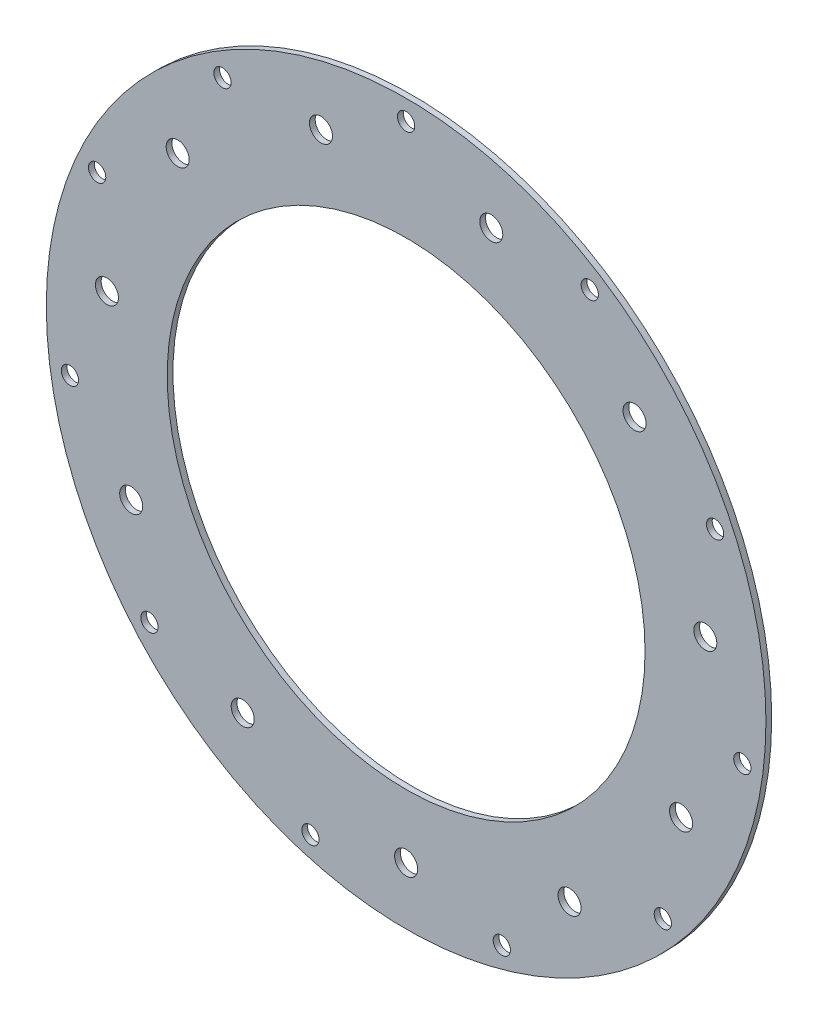
ISO-10303-21;
HEADER;
FILE_DESCRIPTION(('STEP AP214'),'2;1');
FILE_NAME('part.step','',(''),(''),'','','');
FILE_SCHEMA(('AUTOMOTIVE_DESIGN { 1 0 10303 214 1 1 1 1 }'));
ENDSEC;
DATA;
#1=APPLICATION_CONTEXT('core data for automotive mechanical design processes');
#2=APPLICATION_PROTOCOL_DEFINITION('international standard','automotive_design',2000,#1);
#3=PRODUCT_CONTEXT('',#1,'mechanical');
#4=PRODUCT('Part','Part','',(#3));
#5=PRODUCT_RELATED_PRODUCT_CATEGORY('part','',(#4));
#6=PRODUCT_DEFINITION_FORMATION('','',#4);
#7=PRODUCT_DEFINITION_CONTEXT('part definition',#1,'design');
#8=PRODUCT_DEFINITION('design','',#6,#7);
#9=PRODUCT_DEFINITION_SHAPE('','',#8);
#10=(LENGTH_UNIT() NAMED_UNIT(*) SI_UNIT(.MILLI.,.METRE.));
#11=(NAMED_UNIT(*) PLANE_ANGLE_UNIT() SI_UNIT($,.RADIAN.));
#12=(NAMED_UNIT(*) SI_UNIT($,.STERADIAN.) SOLID_ANGLE_UNIT());
#13=UNCERTAINTY_MEASURE_WITH_UNIT(LENGTH_MEASURE(1.E-05),#10,'distance_accuracy_value','');
#14=(GEOMETRIC_REPRESENTATION_CONTEXT(3) GLOBAL_UNCERTAINTY_ASSIGNED_CONTEXT((#13)) GLOBAL_UNIT_ASSIGNED_CONTEXT((#10,
#11,#12)) REPRESENTATION_CONTEXT('',''));
#15=CARTESIAN_POINT('',(0.,0.,0.));
#16=DIRECTION('',(0.,0.,1.));
#17=DIRECTION('',(1.,0.,0.));
#18=AXIS2_PLACEMENT_3D('',#15,#16,#17);
#19=CARTESIAN_POINT('',(0.,0.,1.));
#20=DIRECTION('',(0.,0.,1.));
#21=DIRECTION('',(1.,0.,0.));
#22=AXIS2_PLACEMENT_3D('',#19,#20,#21);
#23=PLANE('',#22);
#24=CARTESIAN_POINT('',(47.755679756112,-21.8092881825996,1.));
#25=DIRECTION('',(0.,0.,1.));
#26=DIRECTION('',(1.,0.,0.));
#27=AXIS2_PLACEMENT_3D('',#24,#25,#26);
#28=CIRCLE('',#27,2.);
#29=CARTESIAN_POINT('',(49.755679756112,-21.8092881825996,1.));
#30=VERTEX_POINT('',#29);
#31=EDGE_CURVE('E170',#30,#30,#28,.T.);
#32=ORIENTED_EDGE('',*,*,#31,.F.);
#33=EDGE_LOOP('',(#32));
#34=FACE_BOUND('',#33,.T.);
#35=CARTESIAN_POINT('',(39.6768526535989,34.3801885321271,1.));
#36=DIRECTION('',(0.,0.,1.));
#37=DIRECTION('',(1.,0.,0.));
#38=AXIS2_PLACEMENT_3D('',#35,#36,#37);
#39=CIRCLE('',#38,2.);
#40=CARTESIAN_POINT('',(41.6768526535989,34.3801885321271,1.));
#41=VERTEX_POINT('',#40);
#42=EDGE_CURVE('E158',#41,#41,#39,.T.);
#43=ORIENTED_EDGE('',*,*,#42,.F.);
#44=EDGE_LOOP('',(#43));
#45=FACE_BOUND('',#44,.T.);
#46=CARTESIAN_POINT('',(-14.7909592341747,50.3733811147612,1.));
#47=DIRECTION('',(0.,0.,1.));
#48=DIRECTION('',(1.,0.,0.));
#49=AXIS2_PLACEMENT_3D('',#46,#47,#48);
#50=CIRCLE('',#49,2.);
#51=CARTESIAN_POINT('',(-12.7909592341747,50.3733811147612,1.));
#52=VERTEX_POINT('',#51);
#53=EDGE_CURVE('E146',#52,#52,#50,.T.);
#54=ORIENTED_EDGE('',*,*,#53,.F.);
#55=EDGE_LOOP('',(#54));
#56=FACE_BOUND('',#55,.T.);
#57=CARTESIAN_POINT('',(-51.9656256987489,7.47152900934767,1.));
#58=DIRECTION('',(0.,0.,1.));
#59=DIRECTION('',(1.,0.,0.));
#60=AXIS2_PLACEMENT_3D('',#57,#58,#59);
#61=CIRCLE('',#60,2.);
#62=CARTESIAN_POINT('',(-49.9656256987489,7.47152900934767,1.));
#63=VERTEX_POINT('',#62);
#64=EDGE_CURVE('E134',#63,#63,#61,.T.);
#65=ORIENTED_EDGE('',*,*,#64,.F.);
#66=EDGE_LOOP('',(#65));
#67=FACE_BOUND('',#66,.T.);
#68=CARTESIAN_POINT('',(-28.3836429164189,-44.165810473637,1.));
#69=DIRECTION('',(0.,0.,1.));
#70=DIRECTION('',(1.,0.,0.));
#71=AXIS2_PLACEMENT_3D('',#68,#69,#70);
#72=CIRCLE('',#71,2.);
#73=CARTESIAN_POINT('',(-26.3836429164189,-44.165810473637,1.));
#74=VERTEX_POINT('',#73);
#75=EDGE_CURVE('E122',#74,#74,#72,.T.);
#76=ORIENTED_EDGE('',*,*,#75,.F.);
#77=EDGE_LOOP('',(#76));
#78=FACE_BOUND('',#77,.T.);
#79=CARTESIAN_POINT('',(44.5892248869008,-38.6367833027724,1.));
#80=DIRECTION('',(0.,0.,1.));
#81=DIRECTION('',(1.,0.,0.));
#82=AXIS2_PLACEMENT_3D('',#79,#80,#81);
#83=CIRCLE('',#82,1.5);
#84=CARTESIAN_POINT('',(46.0892248869008,-38.6367833027724,1.));
#85=VERTEX_POINT('',#84);
#86=EDGE_CURVE('E110',#85,#85,#83,.T.);
#87=ORIENTED_EDGE('',*,*,#86,.F.);
#88=EDGE_LOOP('',(#87));
#89=FACE_BOUND('',#88,.T.);
#90=CARTESIAN_POINT('',(53.6682877259168,24.5094857671108,1.));
#91=DIRECTION('',(0.,0.,1.));
#92=DIRECTION('',(1.,0.,0.));
#93=AXIS2_PLACEMENT_3D('',#90,#91,#92);
#94=CIRCLE('',#93,1.5);
#95=CARTESIAN_POINT('',(55.1682877259168,24.5094857671108,1.));
#96=VERTEX_POINT('',#95);
#97=EDGE_CURVE('E98',#96,#96,#94,.T.);
#98=ORIENTED_EDGE('',*,*,#97,.F.);
#99=EDGE_LOOP('',(#98));
#100=FACE_BOUND('',#99,.T.);
#101=CARTESIAN_POINT('',(4.30211422042248E-13,59.,1.));
#102=DIRECTION('',(0.,0.,1.));
#103=DIRECTION('',(1.,0.,0.));
#104=AXIS2_PLACEMENT_3D('',#101,#102,#103);
#105=CIRCLE('',#104,1.5);
#106=CARTESIAN_POINT('',(1.50000000000043,59.,1.));
#107=VERTEX_POINT('',#106);
#108=EDGE_CURVE('E86',#107,#107,#105,.T.);
#109=ORIENTED_EDGE('',*,*,#108,.F.);
#110=EDGE_LOOP('',(#109));
#111=FACE_BOUND('',#110,.T.);
#112=CARTESIAN_POINT('',(-53.6682877259165,24.5094857671115,1.));
#113=DIRECTION('',(0.,0.,1.));
#114=DIRECTION('',(1.,0.,0.));
#115=AXIS2_PLACEMENT_3D('',#112,#113,#114);
#116=CIRCLE('',#115,1.5);
#117=CARTESIAN_POINT('',(-52.1682877259165,24.5094857671115,1.));
#118=VERTEX_POINT('',#117);
#119=EDGE_CURVE('E74',#118,#118,#116,.T.);
#120=ORIENTED_EDGE('',*,*,#119,.F.);
#121=EDGE_LOOP('',(#120));
#122=FACE_BOUND('',#121,.T.);
#123=CARTESIAN_POINT('',(-44.5892248869013,-38.6367833027717,1.));
#124=DIRECTION('',(0.,0.,1.));
#125=DIRECTION('',(1.,0.,0.));
#126=AXIS2_PLACEMENT_3D('',#123,#124,#125);
#127=CIRCLE('',#126,1.5);
#128=CARTESIAN_POINT('',(-43.0892248869013,-38.6367833027717,1.));
#129=VERTEX_POINT('',#128);
#130=EDGE_CURVE('E62',#129,#129,#127,.T.);
#131=ORIENTED_EDGE('',*,*,#130,.F.);
#132=EDGE_LOOP('',(#131));
#133=FACE_BOUND('',#132,.T.);
#134=CARTESIAN_POINT('',(-16.6222208536444,-56.6100854432553,1.));
#135=DIRECTION('',(0.,0.,1.));
#136=DIRECTION('',(1.,0.,0.));
#137=AXIS2_PLACEMENT_3D('',#134,#135,#136);
#138=CIRCLE('',#137,1.5);
#139=CARTESIAN_POINT('',(-15.1222208536444,-56.6100854432553,1.));
#140=VERTEX_POINT('',#139);
#141=EDGE_CURVE('E50',#140,#140,#138,.T.);
#142=ORIENTED_EDGE('',*,*,#141,.F.);
#143=EDGE_LOOP('',(#142));
#144=FACE_BOUND('',#143,.T.);
#145=CARTESIAN_POINT('',(0.,0.,1.));
#146=DIRECTION('',(0.,0.,1.));
#147=DIRECTION('',(1.,0.,0.));
#148=AXIS2_PLACEMENT_3D('',#145,#146,#147);
#149=CIRCLE('',#148,62.5);
#150=CARTESIAN_POINT('',(62.5,0.,1.));
#151=VERTEX_POINT('',#150);
#152=EDGE_CURVE('E10',#151,#151,#149,.T.);
#153=ORIENTED_EDGE('',*,*,#152,.T.);
#154=EDGE_LOOP('',(#153));
#155=FACE_BOUND('',#154,.T.);
#156=CARTESIAN_POINT('',(0.,0.,1.));
#157=DIRECTION('',(0.,0.,1.));
#158=DIRECTION('',(1.,0.,0.));
#159=AXIS2_PLACEMENT_3D('',#156,#157,#158);
#160=CIRCLE('',#159,41.5);
#161=CARTESIAN_POINT('',(41.5,0.,1.));
#162=VERTEX_POINT('',#161);
#163=EDGE_CURVE('E45',#162,#162,#160,.T.);
#164=ORIENTED_EDGE('',*,*,#163,.F.);
#165=EDGE_LOOP('',(#164));
#166=FACE_BOUND('',#165,.T.);
#167=CARTESIAN_POINT('',(0.,-52.5,1.));
#168=DIRECTION('',(0.,0.,1.));
#169=DIRECTION('',(1.,0.,0.));
#170=AXIS2_PLACEMENT_3D('',#167,#168,#169);
#171=CIRCLE('',#170,2.);
#172=CARTESIAN_POINT('',(2.,-52.5,1.));
#173=VERTEX_POINT('',#172);
#174=EDGE_CURVE('E56',#173,#173,#171,.T.);
#175=ORIENTED_EDGE('',*,*,#174,.F.);
#176=EDGE_LOOP('',(#175));
#177=FACE_BOUND('',#176,.T.);
#178=CARTESIAN_POINT('',(-58.3994650709751,-8.39657545812364,1.));
#179=DIRECTION('',(0.,0.,1.));
#180=DIRECTION('',(1.,0.,0.));
#181=AXIS2_PLACEMENT_3D('',#178,#179,#180);
#182=CIRCLE('',#181,1.50000000000001);
#183=CARTESIAN_POINT('',(-56.8994650709751,-8.39657545812364,1.));
#184=VERTEX_POINT('',#183);
#185=EDGE_CURVE('E68',#184,#184,#182,.T.);
#186=ORIENTED_EDGE('',*,*,#185,.F.);
#187=EDGE_LOOP('',(#186));
#188=FACE_BOUND('',#187,.T.);
#189=CARTESIAN_POINT('',(-31.89780822988,49.6339584370399,1.));
#190=DIRECTION('',(0.,0.,1.));
#191=DIRECTION('',(1.,0.,0.));
#192=AXIS2_PLACEMENT_3D('',#189,#190,#191);
#193=CIRCLE('',#192,1.5);
#194=CARTESIAN_POINT('',(-30.3978082298799,49.6339584370399,1.));
#195=VERTEX_POINT('',#194);
#196=EDGE_CURVE('E80',#195,#195,#193,.T.);
#197=ORIENTED_EDGE('',*,*,#196,.F.);
#198=EDGE_LOOP('',(#197));
#199=FACE_BOUND('',#198,.T.);
#200=CARTESIAN_POINT('',(31.8978082298807,49.6339584370394,1.));
#201=DIRECTION('',(0.,0.,1.));
#202=DIRECTION('',(1.,0.,0.));
#203=AXIS2_PLACEMENT_3D('',#200,#201,#202);
#204=CIRCLE('',#203,1.5);
#205=CARTESIAN_POINT('',(33.3978082298807,49.6339584370394,1.));
#206=VERTEX_POINT('',#205);
#207=EDGE_CURVE('E92',#206,#206,#204,.T.);
#208=ORIENTED_EDGE('',*,*,#207,.F.);
#209=EDGE_LOOP('',(#208));
#210=FACE_BOUND('',#209,.T.);
#211=CARTESIAN_POINT('',(58.3994650709749,-8.39657545812446,1.));
#212=DIRECTION('',(0.,0.,1.));
#213=DIRECTION('',(1.,0.,0.));
#214=AXIS2_PLACEMENT_3D('',#211,#212,#213);
#215=CIRCLE('',#214,1.5);
#216=CARTESIAN_POINT('',(59.8994650709749,-8.39657545812446,1.));
#217=VERTEX_POINT('',#216);
#218=EDGE_CURVE('E104',#217,#217,#215,.T.);
#219=ORIENTED_EDGE('',*,*,#218,.F.);
#220=EDGE_LOOP('',(#219));
#221=FACE_BOUND('',#220,.T.);
#222=CARTESIAN_POINT('',(16.6222208536436,-56.6100854432556,1.));
#223=DIRECTION('',(0.,0.,1.));
#224=DIRECTION('',(1.,0.,0.));
#225=AXIS2_PLACEMENT_3D('',#222,#223,#224);
#226=CIRCLE('',#225,1.50000000000001);
#227=CARTESIAN_POINT('',(18.1222208536436,-56.6100854432556,1.));
#228=VERTEX_POINT('',#227);
#229=EDGE_CURVE('E116',#228,#228,#226,.T.);
#230=ORIENTED_EDGE('',*,*,#229,.F.);
#231=EDGE_LOOP('',(#230));
#232=FACE_BOUND('',#231,.T.);
#233=CARTESIAN_POINT('',(-47.7556797561123,-21.8092881825989,1.));
#234=DIRECTION('',(0.,0.,1.));
#235=DIRECTION('',(1.,0.,0.));
#236=AXIS2_PLACEMENT_3D('',#233,#234,#235);
#237=CIRCLE('',#236,2.);
#238=CARTESIAN_POINT('',(-45.7556797561123,-21.8092881825989,1.));
#239=VERTEX_POINT('',#238);
#240=EDGE_CURVE('E128',#239,#239,#237,.T.);
#241=ORIENTED_EDGE('',*,*,#240,.F.);
#242=EDGE_LOOP('',(#241));
#243=FACE_BOUND('',#242,.T.);
#244=CARTESIAN_POINT('',(-39.6768526535984,34.3801885321277,1.));
#245=DIRECTION('',(0.,0.,1.));
#246=DIRECTION('',(1.,0.,0.));
#247=AXIS2_PLACEMENT_3D('',#244,#245,#246);
#248=CIRCLE('',#247,2.);
#249=CARTESIAN_POINT('',(-37.6768526535984,34.3801885321277,1.));
#250=VERTEX_POINT('',#249);
#251=EDGE_CURVE('E140',#250,#250,#248,.T.);
#252=ORIENTED_EDGE('',*,*,#251,.F.);
#253=EDGE_LOOP('',(#252));
#254=FACE_BOUND('',#253,.T.);
#255=CARTESIAN_POINT('',(14.7909592341754,50.373381114761,1.));
#256=DIRECTION('',(0.,0.,1.));
#257=DIRECTION('',(1.,0.,0.));
#258=AXIS2_PLACEMENT_3D('',#255,#256,#257);
#259=CIRCLE('',#258,2.);
#260=CARTESIAN_POINT('',(16.7909592341754,50.373381114761,1.));
#261=VERTEX_POINT('',#260);
#262=EDGE_CURVE('E152',#261,#261,#259,.T.);
#263=ORIENTED_EDGE('',*,*,#262,.F.);
#264=EDGE_LOOP('',(#263));
#265=FACE_BOUND('',#264,.T.);
#266=CARTESIAN_POINT('',(51.965625698749,7.47152900934692,1.));
#267=DIRECTION('',(0.,0.,1.));
#268=DIRECTION('',(1.,0.,0.));
#269=AXIS2_PLACEMENT_3D('',#266,#267,#268);
#270=CIRCLE('',#269,2.);
#271=CARTESIAN_POINT('',(53.965625698749,7.47152900934692,1.));
#272=VERTEX_POINT('',#271);
#273=EDGE_CURVE('E164',#272,#272,#270,.T.);
#274=ORIENTED_EDGE('',*,*,#273,.F.);
#275=EDGE_LOOP('',(#274));
#276=FACE_BOUND('',#275,.T.);
#277=CARTESIAN_POINT('',(28.3836429164183,-44.1658104736374,1.));
#278=DIRECTION('',(0.,0.,1.));
#279=DIRECTION('',(1.,0.,0.));
#280=AXIS2_PLACEMENT_3D('',#277,#278,#279);
#281=CIRCLE('',#280,1.99999999999999);
#282=CARTESIAN_POINT('',(30.3836429164183,-44.1658104736374,1.));
#283=VERTEX_POINT('',#282);
#284=EDGE_CURVE('E176',#283,#283,#281,.T.);
#285=ORIENTED_EDGE('',*,*,#284,.F.);
#286=EDGE_LOOP('',(#285));
#287=FACE_BOUND('',#286,.T.);
#288=ADVANCED_FACE('F34',(#34,#45,#56,#67,#78,#89,#100,#111,#122,#133,#144,#155,#166,#177,#188,
#199,#210,#221,#232,#243,#254,#265,#276,#287),#23,.T.);
#289=CARTESIAN_POINT('',(0.,0.,0.));
#290=DIRECTION('',(0.,0.,1.));
#291=DIRECTION('',(1.,0.,0.));
#292=AXIS2_PLACEMENT_3D('',#289,#290,#291);
#293=PLANE('',#292);
#294=CARTESIAN_POINT('',(0.,0.,0.));
#295=DIRECTION('',(0.,0.,1.));
#296=DIRECTION('',(1.,0.,0.));
#297=AXIS2_PLACEMENT_3D('',#294,#295,#296);
#298=CIRCLE('',#297,62.5);
#299=CARTESIAN_POINT('',(62.5,0.,0.));
#300=VERTEX_POINT('',#299);
#301=EDGE_CURVE('E38',#300,#300,#298,.T.);
#302=ORIENTED_EDGE('',*,*,#301,.F.);
#303=EDGE_LOOP('',(#302));
#304=FACE_BOUND('',#303,.T.);
#305=CARTESIAN_POINT('',(0.,0.,0.));
#306=DIRECTION('',(0.,0.,1.));
#307=DIRECTION('',(1.,0.,0.));
#308=AXIS2_PLACEMENT_3D('',#305,#306,#307);
#309=CIRCLE('',#308,41.5);
#310=CARTESIAN_POINT('',(41.5,0.,0.));
#311=VERTEX_POINT('',#310);
#312=EDGE_CURVE('E47',#311,#311,#309,.T.);
#313=ORIENTED_EDGE('',*,*,#312,.T.);
#314=EDGE_LOOP('',(#313));
#315=FACE_BOUND('',#314,.T.);
#316=CARTESIAN_POINT('',(-16.6222208536444,-56.6100854432553,0.));
#317=DIRECTION('',(0.,0.,1.));
#318=DIRECTION('',(1.,0.,0.));
#319=AXIS2_PLACEMENT_3D('',#316,#317,#318);
#320=CIRCLE('',#319,1.5);
#321=CARTESIAN_POINT('',(-15.1222208536444,-56.6100854432553,0.));
#322=VERTEX_POINT('',#321);
#323=EDGE_CURVE('E53',#322,#322,#320,.T.);
#324=ORIENTED_EDGE('',*,*,#323,.T.);
#325=EDGE_LOOP('',(#324));
#326=FACE_BOUND('',#325,.T.);
#327=CARTESIAN_POINT('',(0.,-52.5,0.));
#328=DIRECTION('',(0.,0.,1.));
#329=DIRECTION('',(1.,0.,0.));
#330=AXIS2_PLACEMENT_3D('',#327,#328,#329);
#331=CIRCLE('',#330,2.);
#332=CARTESIAN_POINT('',(2.,-52.5,0.));
#333=VERTEX_POINT('',#332);
#334=EDGE_CURVE('E59',#333,#333,#331,.T.);
#335=ORIENTED_EDGE('',*,*,#334,.T.);
#336=EDGE_LOOP('',(#335));
#337=FACE_BOUND('',#336,.T.);
#338=CARTESIAN_POINT('',(-44.5892248869013,-38.6367833027717,0.));
#339=DIRECTION('',(0.,0.,1.));
#340=DIRECTION('',(1.,0.,0.));
#341=AXIS2_PLACEMENT_3D('',#338,#339,#340);
#342=CIRCLE('',#341,1.5);
#343=CARTESIAN_POINT('',(-43.0892248869013,-38.6367833027717,0.));
#344=VERTEX_POINT('',#343);
#345=EDGE_CURVE('E65',#344,#344,#342,.T.);
#346=ORIENTED_EDGE('',*,*,#345,.T.);
#347=EDGE_LOOP('',(#346));
#348=FACE_BOUND('',#347,.T.);
#349=CARTESIAN_POINT('',(-58.3994650709751,-8.39657545812364,0.));
#350=DIRECTION('',(0.,0.,1.));
#351=DIRECTION('',(1.,0.,0.));
#352=AXIS2_PLACEMENT_3D('',#349,#350,#351);
#353=CIRCLE('',#352,1.50000000000001);
#354=CARTESIAN_POINT('',(-56.8994650709751,-8.39657545812364,0.));
#355=VERTEX_POINT('',#354);
#356=EDGE_CURVE('E71',#355,#355,#353,.T.);
#357=ORIENTED_EDGE('',*,*,#356,.T.);
#358=EDGE_LOOP('',(#357));
#359=FACE_BOUND('',#358,.T.);
#360=CARTESIAN_POINT('',(-53.6682877259165,24.5094857671115,0.));
#361=DIRECTION('',(0.,0.,1.));
#362=DIRECTION('',(1.,0.,0.));
#363=AXIS2_PLACEMENT_3D('',#360,#361,#362);
#364=CIRCLE('',#363,1.5);
#365=CARTESIAN_POINT('',(-52.1682877259165,24.5094857671115,0.));
#366=VERTEX_POINT('',#365);
#367=EDGE_CURVE('E77',#366,#366,#364,.T.);
#368=ORIENTED_EDGE('',*,*,#367,.T.);
#369=EDGE_LOOP('',(#368));
#370=FACE_BOUND('',#369,.T.);
#371=CARTESIAN_POINT('',(-31.89780822988,49.6339584370399,0.));
#372=DIRECTION('',(0.,0.,1.));
#373=DIRECTION('',(1.,0.,0.));
#374=AXIS2_PLACEMENT_3D('',#371,#372,#373);
#375=CIRCLE('',#374,1.5);
#376=CARTESIAN_POINT('',(-30.3978082298799,49.6339584370399,0.));
#377=VERTEX_POINT('',#376);
#378=EDGE_CURVE('E83',#377,#377,#375,.T.);
#379=ORIENTED_EDGE('',*,*,#378,.T.);
#380=EDGE_LOOP('',(#379));
#381=FACE_BOUND('',#380,.T.);
#382=CARTESIAN_POINT('',(4.30211422042248E-13,59.,0.));
#383=DIRECTION('',(0.,0.,1.));
#384=DIRECTION('',(1.,0.,0.));
#385=AXIS2_PLACEMENT_3D('',#382,#383,#384);
#386=CIRCLE('',#385,1.5);
#387=CARTESIAN_POINT('',(1.50000000000043,59.,0.));
#388=VERTEX_POINT('',#387);
#389=EDGE_CURVE('E89',#388,#388,#386,.T.);
#390=ORIENTED_EDGE('',*,*,#389,.T.);
#391=EDGE_LOOP('',(#390));
#392=FACE_BOUND('',#391,.T.);
#393=CARTESIAN_POINT('',(31.8978082298807,49.6339584370394,0.));
#394=DIRECTION('',(0.,0.,1.));
#395=DIRECTION('',(1.,0.,0.));
#396=AXIS2_PLACEMENT_3D('',#393,#394,#395);
#397=CIRCLE('',#396,1.5);
#398=CARTESIAN_POINT('',(33.3978082298807,49.6339584370394,0.));
#399=VERTEX_POINT('',#398);
#400=EDGE_CURVE('E95',#399,#399,#397,.T.);
#401=ORIENTED_EDGE('',*,*,#400,.T.);
#402=EDGE_LOOP('',(#401));
#403=FACE_BOUND('',#402,.T.);
#404=CARTESIAN_POINT('',(53.6682877259168,24.5094857671108,0.));
#405=DIRECTION('',(0.,0.,1.));
#406=DIRECTION('',(1.,0.,0.));
#407=AXIS2_PLACEMENT_3D('',#404,#405,#406);
#408=CIRCLE('',#407,1.5);
#409=CARTESIAN_POINT('',(55.1682877259168,24.5094857671108,0.));
#410=VERTEX_POINT('',#409);
#411=EDGE_CURVE('E101',#410,#410,#408,.T.);
#412=ORIENTED_EDGE('',*,*,#411,.T.);
#413=EDGE_LOOP('',(#412));
#414=FACE_BOUND('',#413,.T.);
#415=CARTESIAN_POINT('',(58.3994650709749,-8.39657545812446,0.));
#416=DIRECTION('',(0.,0.,1.));
#417=DIRECTION('',(1.,0.,0.));
#418=AXIS2_PLACEMENT_3D('',#415,#416,#417);
#419=CIRCLE('',#418,1.5);
#420=CARTESIAN_POINT('',(59.8994650709749,-8.39657545812446,0.));
#421=VERTEX_POINT('',#420);
#422=EDGE_CURVE('E107',#421,#421,#419,.T.);
#423=ORIENTED_EDGE('',*,*,#422,.T.);
#424=EDGE_LOOP('',(#423));
#425=FACE_BOUND('',#424,.T.);
#426=CARTESIAN_POINT('',(44.5892248869008,-38.6367833027724,0.));
#427=DIRECTION('',(0.,0.,1.));
#428=DIRECTION('',(1.,0.,0.));
#429=AXIS2_PLACEMENT_3D('',#426,#427,#428);
#430=CIRCLE('',#429,1.5);
#431=CARTESIAN_POINT('',(46.0892248869008,-38.6367833027724,0.));
#432=VERTEX_POINT('',#431);
#433=EDGE_CURVE('E113',#432,#432,#430,.T.);
#434=ORIENTED_EDGE('',*,*,#433,.T.);
#435=EDGE_LOOP('',(#434));
#436=FACE_BOUND('',#435,.T.);
#437=CARTESIAN_POINT('',(16.6222208536436,-56.6100854432556,0.));
#438=DIRECTION('',(0.,0.,1.));
#439=DIRECTION('',(1.,0.,0.));
#440=AXIS2_PLACEMENT_3D('',#437,#438,#439);
#441=CIRCLE('',#440,1.50000000000001);
#442=CARTESIAN_POINT('',(18.1222208536436,-56.6100854432556,0.));
#443=VERTEX_POINT('',#442);
#444=EDGE_CURVE('E119',#443,#443,#441,.T.);
#445=ORIENTED_EDGE('',*,*,#444,.T.);
#446=EDGE_LOOP('',(#445));
#447=FACE_BOUND('',#446,.T.);
#448=CARTESIAN_POINT('',(-28.3836429164189,-44.165810473637,0.));
#449=DIRECTION('',(0.,0.,1.));
#450=DIRECTION('',(1.,0.,0.));
#451=AXIS2_PLACEMENT_3D('',#448,#449,#450);
#452=CIRCLE('',#451,2.);
#453=CARTESIAN_POINT('',(-26.3836429164189,-44.165810473637,0.));
#454=VERTEX_POINT('',#453);
#455=EDGE_CURVE('E125',#454,#454,#452,.T.);
#456=ORIENTED_EDGE('',*,*,#455,.T.);
#457=EDGE_LOOP('',(#456));
#458=FACE_BOUND('',#457,.T.);
#459=CARTESIAN_POINT('',(-47.7556797561123,-21.8092881825989,0.));
#460=DIRECTION('',(0.,0.,1.));
#461=DIRECTION('',(1.,0.,0.));
#462=AXIS2_PLACEMENT_3D('',#459,#460,#461);
#463=CIRCLE('',#462,2.);
#464=CARTESIAN_POINT('',(-45.7556797561123,-21.8092881825989,0.));
#465=VERTEX_POINT('',#464);
#466=EDGE_CURVE('E131',#465,#465,#463,.T.);
#467=ORIENTED_EDGE('',*,*,#466,.T.);
#468=EDGE_LOOP('',(#467));
#469=FACE_BOUND('',#468,.T.);
#470=CARTESIAN_POINT('',(-51.9656256987489,7.47152900934767,0.));
#471=DIRECTION('',(0.,0.,1.));
#472=DIRECTION('',(1.,0.,0.));
#473=AXIS2_PLACEMENT_3D('',#470,#471,#472);
#474=CIRCLE('',#473,2.);
#475=CARTESIAN_POINT('',(-49.9656256987489,7.47152900934767,0.));
#476=VERTEX_POINT('',#475);
#477=EDGE_CURVE('E137',#476,#476,#474,.T.);
#478=ORIENTED_EDGE('',*,*,#477,.T.);
#479=EDGE_LOOP('',(#478));
#480=FACE_BOUND('',#479,.T.);
#481=CARTESIAN_POINT('',(-39.6768526535984,34.3801885321277,0.));
#482=DIRECTION('',(0.,0.,1.));
#483=DIRECTION('',(1.,0.,0.));
#484=AXIS2_PLACEMENT_3D('',#481,#482,#483);
#485=CIRCLE('',#484,2.);
#486=CARTESIAN_POINT('',(-37.6768526535984,34.3801885321277,0.));
#487=VERTEX_POINT('',#486);
#488=EDGE_CURVE('E143',#487,#487,#485,.T.);
#489=ORIENTED_EDGE('',*,*,#488,.T.);
#490=EDGE_LOOP('',(#489));
#491=FACE_BOUND('',#490,.T.);
#492=CARTESIAN_POINT('',(-14.7909592341747,50.3733811147612,0.));
#493=DIRECTION('',(0.,0.,1.));
#494=DIRECTION('',(1.,0.,0.));
#495=AXIS2_PLACEMENT_3D('',#492,#493,#494);
#496=CIRCLE('',#495,2.);
#497=CARTESIAN_POINT('',(-12.7909592341747,50.3733811147612,0.));
#498=VERTEX_POINT('',#497);
#499=EDGE_CURVE('E149',#498,#498,#496,.T.);
#500=ORIENTED_EDGE('',*,*,#499,.T.);
#501=EDGE_LOOP('',(#500));
#502=FACE_BOUND('',#501,.T.);
#503=CARTESIAN_POINT('',(14.7909592341754,50.373381114761,0.));
#504=DIRECTION('',(0.,0.,1.));
#505=DIRECTION('',(1.,0.,0.));
#506=AXIS2_PLACEMENT_3D('',#503,#504,#505);
#507=CIRCLE('',#506,2.);
#508=CARTESIAN_POINT('',(16.7909592341754,50.373381114761,0.));
#509=VERTEX_POINT('',#508);
#510=EDGE_CURVE('E155',#509,#509,#507,.T.);
#511=ORIENTED_EDGE('',*,*,#510,.T.);
#512=EDGE_LOOP('',(#511));
#513=FACE_BOUND('',#512,.T.);
#514=CARTESIAN_POINT('',(39.6768526535989,34.3801885321271,0.));
#515=DIRECTION('',(0.,0.,1.));
#516=DIRECTION('',(1.,0.,0.));
#517=AXIS2_PLACEMENT_3D('',#514,#515,#516);
#518=CIRCLE('',#517,2.);
#519=CARTESIAN_POINT('',(41.6768526535989,34.3801885321271,0.));
#520=VERTEX_POINT('',#519);
#521=EDGE_CURVE('E161',#520,#520,#518,.T.);
#522=ORIENTED_EDGE('',*,*,#521,.T.);
#523=EDGE_LOOP('',(#522));
#524=FACE_BOUND('',#523,.T.);
#525=CARTESIAN_POINT('',(51.965625698749,7.47152900934692,0.));
#526=DIRECTION('',(0.,0.,1.));
#527=DIRECTION('',(1.,0.,0.));
#528=AXIS2_PLACEMENT_3D('',#525,#526,#527);
#529=CIRCLE('',#528,2.);
#530=CARTESIAN_POINT('',(53.965625698749,7.47152900934692,0.));
#531=VERTEX_POINT('',#530);
#532=EDGE_CURVE('E167',#531,#531,#529,.T.);
#533=ORIENTED_EDGE('',*,*,#532,.T.);
#534=EDGE_LOOP('',(#533));
#535=FACE_BOUND('',#534,.T.);
#536=CARTESIAN_POINT('',(47.755679756112,-21.8092881825996,0.));
#537=DIRECTION('',(0.,0.,1.));
#538=DIRECTION('',(1.,0.,0.));
#539=AXIS2_PLACEMENT_3D('',#536,#537,#538);
#540=CIRCLE('',#539,2.);
#541=CARTESIAN_POINT('',(49.755679756112,-21.8092881825996,0.));
#542=VERTEX_POINT('',#541);
#543=EDGE_CURVE('E173',#542,#542,#540,.T.);
#544=ORIENTED_EDGE('',*,*,#543,.T.);
#545=EDGE_LOOP('',(#544));
#546=FACE_BOUND('',#545,.T.);
#547=CARTESIAN_POINT('',(28.3836429164183,-44.1658104736374,0.));
#548=DIRECTION('',(0.,0.,1.));
#549=DIRECTION('',(1.,0.,0.));
#550=AXIS2_PLACEMENT_3D('',#547,#548,#549);
#551=CIRCLE('',#550,1.99999999999999);
#552=CARTESIAN_POINT('',(30.3836429164183,-44.1658104736374,0.));
#553=VERTEX_POINT('',#552);
#554=EDGE_CURVE('E179',#553,#553,#551,.T.);
#555=ORIENTED_EDGE('',*,*,#554,.T.);
#556=EDGE_LOOP('',(#555));
#557=FACE_BOUND('',#556,.T.);
#558=ADVANCED_FACE('F189',(#304,#315,#326,#337,#348,#359,#370,#381,#392,#403,#414,#425,#436,
#447,#458,#469,#480,#491,#502,#513,#524,#535,#546,#557),#293,.F.);
#559=CARTESIAN_POINT('',(0.,0.,1.));
#560=DIRECTION('',(0.,0.,-1.));
#561=DIRECTION('',(-1.,0.,0.));
#562=AXIS2_PLACEMENT_3D('',#559,#560,#561);
#563=CYLINDRICAL_SURFACE('',#562,62.5);
#564=ORIENTED_EDGE('',*,*,#152,.F.);
#565=EDGE_LOOP('',(#564));
#566=FACE_BOUND('',#565,.T.);
#567=ORIENTED_EDGE('',*,*,#301,.T.);
#568=EDGE_LOOP('',(#567));
#569=FACE_BOUND('',#568,.T.);
#570=ADVANCED_FACE('F36',(#566,#569),#563,.T.);
#571=CARTESIAN_POINT('',(0.,0.,1.));
#572=DIRECTION('',(0.,0.,-1.));
#573=DIRECTION('',(-1.,0.,0.));
#574=AXIS2_PLACEMENT_3D('',#571,#572,#573);
#575=CYLINDRICAL_SURFACE('',#574,41.5);
#576=ORIENTED_EDGE('',*,*,#163,.T.);
#577=EDGE_LOOP('',(#576));
#578=FACE_BOUND('',#577,.T.);
#579=ORIENTED_EDGE('',*,*,#312,.F.);
#580=EDGE_LOOP('',(#579));
#581=FACE_BOUND('',#580,.T.);
#582=ADVANCED_FACE('F199',(#578,#581),#575,.F.);
#583=CARTESIAN_POINT('',(-16.6222208536444,-56.6100854432553,1.));
#584=DIRECTION('',(0.,0.,-1.));
#585=DIRECTION('',(-1.,0.,0.));
#586=AXIS2_PLACEMENT_3D('',#583,#584,#585);
#587=CYLINDRICAL_SURFACE('',#586,1.5);
#588=ORIENTED_EDGE('',*,*,#141,.T.);
#589=EDGE_LOOP('',(#588));
#590=FACE_BOUND('',#589,.T.);
#591=ORIENTED_EDGE('',*,*,#323,.F.);
#592=EDGE_LOOP('',(#591));
#593=FACE_BOUND('',#592,.T.);
#594=ADVANCED_FACE('F202',(#590,#593),#587,.F.);
#595=CARTESIAN_POINT('',(0.,-52.5,1.));
#596=DIRECTION('',(0.,0.,-1.));
#597=DIRECTION('',(-1.,0.,0.));
#598=AXIS2_PLACEMENT_3D('',#595,#596,#597);
#599=CYLINDRICAL_SURFACE('',#598,2.);
#600=ORIENTED_EDGE('',*,*,#174,.T.);
#601=EDGE_LOOP('',(#600));
#602=FACE_BOUND('',#601,.T.);
#603=ORIENTED_EDGE('',*,*,#334,.F.);
#604=EDGE_LOOP('',(#603));
#605=FACE_BOUND('',#604,.T.);
#606=ADVANCED_FACE('F206',(#602,#605),#599,.F.);
#607=CARTESIAN_POINT('',(-44.5892248869013,-38.6367833027717,1.));
#608=DIRECTION('',(0.,0.,-1.));
#609=DIRECTION('',(-1.,0.,0.));
#610=AXIS2_PLACEMENT_3D('',#607,#608,#609);
#611=CYLINDRICAL_SURFACE('',#610,1.5);
#612=ORIENTED_EDGE('',*,*,#130,.T.);
#613=EDGE_LOOP('',(#612));
#614=FACE_BOUND('',#613,.T.);
#615=ORIENTED_EDGE('',*,*,#345,.F.);
#616=EDGE_LOOP('',(#615));
#617=FACE_BOUND('',#616,.T.);
#618=ADVANCED_FACE('F210',(#614,#617),#611,.F.);
#619=CARTESIAN_POINT('',(-58.3994650709751,-8.39657545812364,1.));
#620=DIRECTION('',(0.,0.,-1.));
#621=DIRECTION('',(-1.,0.,0.));
#622=AXIS2_PLACEMENT_3D('',#619,#620,#621);
#623=CYLINDRICAL_SURFACE('',#622,1.50000000000001);
#624=ORIENTED_EDGE('',*,*,#185,.T.);
#625=EDGE_LOOP('',(#624));
#626=FACE_BOUND('',#625,.T.);
#627=ORIENTED_EDGE('',*,*,#356,.F.);
#628=EDGE_LOOP('',(#627));
#629=FACE_BOUND('',#628,.T.);
#630=ADVANCED_FACE('F214',(#626,#629),#623,.F.);
#631=CARTESIAN_POINT('',(-53.6682877259165,24.5094857671115,1.));
#632=DIRECTION('',(0.,0.,-1.));
#633=DIRECTION('',(-1.,0.,0.));
#634=AXIS2_PLACEMENT_3D('',#631,#632,#633);
#635=CYLINDRICAL_SURFACE('',#634,1.5);
#636=ORIENTED_EDGE('',*,*,#119,.T.);
#637=EDGE_LOOP('',(#636));
#638=FACE_BOUND('',#637,.T.);
#639=ORIENTED_EDGE('',*,*,#367,.F.);
#640=EDGE_LOOP('',(#639));
#641=FACE_BOUND('',#640,.T.);
#642=ADVANCED_FACE('F218',(#638,#641),#635,.F.);
#643=CARTESIAN_POINT('',(-31.89780822988,49.6339584370399,1.));
#644=DIRECTION('',(0.,0.,-1.));
#645=DIRECTION('',(-1.,0.,0.));
#646=AXIS2_PLACEMENT_3D('',#643,#644,#645);
#647=CYLINDRICAL_SURFACE('',#646,1.5);
#648=ORIENTED_EDGE('',*,*,#196,.T.);
#649=EDGE_LOOP('',(#648));
#650=FACE_BOUND('',#649,.T.);
#651=ORIENTED_EDGE('',*,*,#378,.F.);
#652=EDGE_LOOP('',(#651));
#653=FACE_BOUND('',#652,.T.);
#654=ADVANCED_FACE('F222',(#650,#653),#647,.F.);
#655=CARTESIAN_POINT('',(4.30211422042248E-13,59.,1.));
#656=DIRECTION('',(0.,0.,-1.));
#657=DIRECTION('',(-1.,0.,0.));
#658=AXIS2_PLACEMENT_3D('',#655,#656,#657);
#659=CYLINDRICAL_SURFACE('',#658,1.5);
#660=ORIENTED_EDGE('',*,*,#108,.T.);
#661=EDGE_LOOP('',(#660));
#662=FACE_BOUND('',#661,.T.);
#663=ORIENTED_EDGE('',*,*,#389,.F.);
#664=EDGE_LOOP('',(#663));
#665=FACE_BOUND('',#664,.T.);
#666=ADVANCED_FACE('F226',(#662,#665),#659,.F.);
#667=CARTESIAN_POINT('',(31.8978082298807,49.6339584370394,1.));
#668=DIRECTION('',(0.,0.,-1.));
#669=DIRECTION('',(-1.,0.,0.));
#670=AXIS2_PLACEMENT_3D('',#667,#668,#669);
#671=CYLINDRICAL_SURFACE('',#670,1.5);
#672=ORIENTED_EDGE('',*,*,#207,.T.);
#673=EDGE_LOOP('',(#672));
#674=FACE_BOUND('',#673,.T.);
#675=ORIENTED_EDGE('',*,*,#400,.F.);
#676=EDGE_LOOP('',(#675));
#677=FACE_BOUND('',#676,.T.);
#678=ADVANCED_FACE('F230',(#674,#677),#671,.F.);
#679=CARTESIAN_POINT('',(53.6682877259168,24.5094857671108,1.));
#680=DIRECTION('',(0.,0.,-1.));
#681=DIRECTION('',(-1.,0.,0.));
#682=AXIS2_PLACEMENT_3D('',#679,#680,#681);
#683=CYLINDRICAL_SURFACE('',#682,1.5);
#684=ORIENTED_EDGE('',*,*,#97,.T.);
#685=EDGE_LOOP('',(#684));
#686=FACE_BOUND('',#685,.T.);
#687=ORIENTED_EDGE('',*,*,#411,.F.);
#688=EDGE_LOOP('',(#687));
#689=FACE_BOUND('',#688,.T.);
#690=ADVANCED_FACE('F234',(#686,#689),#683,.F.);
#691=CARTESIAN_POINT('',(58.3994650709749,-8.39657545812446,1.));
#692=DIRECTION('',(0.,0.,-1.));
#693=DIRECTION('',(-1.,0.,0.));
#694=AXIS2_PLACEMENT_3D('',#691,#692,#693);
#695=CYLINDRICAL_SURFACE('',#694,1.5);
#696=ORIENTED_EDGE('',*,*,#218,.T.);
#697=EDGE_LOOP('',(#696));
#698=FACE_BOUND('',#697,.T.);
#699=ORIENTED_EDGE('',*,*,#422,.F.);
#700=EDGE_LOOP('',(#699));
#701=FACE_BOUND('',#700,.T.);
#702=ADVANCED_FACE('F238',(#698,#701),#695,.F.);
#703=CARTESIAN_POINT('',(44.5892248869008,-38.6367833027724,1.));
#704=DIRECTION('',(0.,0.,-1.));
#705=DIRECTION('',(-1.,0.,0.));
#706=AXIS2_PLACEMENT_3D('',#703,#704,#705);
#707=CYLINDRICAL_SURFACE('',#706,1.5);
#708=ORIENTED_EDGE('',*,*,#86,.T.);
#709=EDGE_LOOP('',(#708));
#710=FACE_BOUND('',#709,.T.);
#711=ORIENTED_EDGE('',*,*,#433,.F.);
#712=EDGE_LOOP('',(#711));
#713=FACE_BOUND('',#712,.T.);
#714=ADVANCED_FACE('F242',(#710,#713),#707,.F.);
#715=CARTESIAN_POINT('',(16.6222208536436,-56.6100854432556,1.));
#716=DIRECTION('',(0.,0.,-1.));
#717=DIRECTION('',(-1.,0.,0.));
#718=AXIS2_PLACEMENT_3D('',#715,#716,#717);
#719=CYLINDRICAL_SURFACE('',#718,1.50000000000001);
#720=ORIENTED_EDGE('',*,*,#229,.T.);
#721=EDGE_LOOP('',(#720));
#722=FACE_BOUND('',#721,.T.);
#723=ORIENTED_EDGE('',*,*,#444,.F.);
#724=EDGE_LOOP('',(#723));
#725=FACE_BOUND('',#724,.T.);
#726=ADVANCED_FACE('F246',(#722,#725),#719,.F.);
#727=CARTESIAN_POINT('',(-28.3836429164189,-44.165810473637,1.));
#728=DIRECTION('',(0.,0.,-1.));
#729=DIRECTION('',(-1.,0.,0.));
#730=AXIS2_PLACEMENT_3D('',#727,#728,#729);
#731=CYLINDRICAL_SURFACE('',#730,2.);
#732=ORIENTED_EDGE('',*,*,#75,.T.);
#733=EDGE_LOOP('',(#732));
#734=FACE_BOUND('',#733,.T.);
#735=ORIENTED_EDGE('',*,*,#455,.F.);
#736=EDGE_LOOP('',(#735));
#737=FACE_BOUND('',#736,.T.);
#738=ADVANCED_FACE('F250',(#734,#737),#731,.F.);
#739=CARTESIAN_POINT('',(-47.7556797561123,-21.8092881825989,1.));
#740=DIRECTION('',(0.,0.,-1.));
#741=DIRECTION('',(-1.,0.,0.));
#742=AXIS2_PLACEMENT_3D('',#739,#740,#741);
#743=CYLINDRICAL_SURFACE('',#742,2.);
#744=ORIENTED_EDGE('',*,*,#240,.T.);
#745=EDGE_LOOP('',(#744));
#746=FACE_BOUND('',#745,.T.);
#747=ORIENTED_EDGE('',*,*,#466,.F.);
#748=EDGE_LOOP('',(#747));
#749=FACE_BOUND('',#748,.T.);
#750=ADVANCED_FACE('F254',(#746,#749),#743,.F.);
#751=CARTESIAN_POINT('',(-51.9656256987489,7.47152900934767,1.));
#752=DIRECTION('',(0.,0.,-1.));
#753=DIRECTION('',(-1.,0.,0.));
#754=AXIS2_PLACEMENT_3D('',#751,#752,#753);
#755=CYLINDRICAL_SURFACE('',#754,2.);
#756=ORIENTED_EDGE('',*,*,#64,.T.);
#757=EDGE_LOOP('',(#756));
#758=FACE_BOUND('',#757,.T.);
#759=ORIENTED_EDGE('',*,*,#477,.F.);
#760=EDGE_LOOP('',(#759));
#761=FACE_BOUND('',#760,.T.);
#762=ADVANCED_FACE('F258',(#758,#761),#755,.F.);
#763=CARTESIAN_POINT('',(-39.6768526535984,34.3801885321277,1.));
#764=DIRECTION('',(0.,0.,-1.));
#765=DIRECTION('',(-1.,0.,0.));
#766=AXIS2_PLACEMENT_3D('',#763,#764,#765);
#767=CYLINDRICAL_SURFACE('',#766,2.);
#768=ORIENTED_EDGE('',*,*,#251,.T.);
#769=EDGE_LOOP('',(#768));
#770=FACE_BOUND('',#769,.T.);
#771=ORIENTED_EDGE('',*,*,#488,.F.);
#772=EDGE_LOOP('',(#771));
#773=FACE_BOUND('',#772,.T.);
#774=ADVANCED_FACE('F262',(#770,#773),#767,.F.);
#775=CARTESIAN_POINT('',(-14.7909592341747,50.3733811147612,1.));
#776=DIRECTION('',(0.,0.,-1.));
#777=DIRECTION('',(-1.,0.,0.));
#778=AXIS2_PLACEMENT_3D('',#775,#776,#777);
#779=CYLINDRICAL_SURFACE('',#778,2.);
#780=ORIENTED_EDGE('',*,*,#53,.T.);
#781=EDGE_LOOP('',(#780));
#782=FACE_BOUND('',#781,.T.);
#783=ORIENTED_EDGE('',*,*,#499,.F.);
#784=EDGE_LOOP('',(#783));
#785=FACE_BOUND('',#784,.T.);
#786=ADVANCED_FACE('F266',(#782,#785),#779,.F.);
#787=CARTESIAN_POINT('',(14.7909592341754,50.373381114761,1.));
#788=DIRECTION('',(0.,0.,-1.));
#789=DIRECTION('',(-1.,0.,0.));
#790=AXIS2_PLACEMENT_3D('',#787,#788,#789);
#791=CYLINDRICAL_SURFACE('',#790,2.);
#792=ORIENTED_EDGE('',*,*,#262,.T.);
#793=EDGE_LOOP('',(#792));
#794=FACE_BOUND('',#793,.T.);
#795=ORIENTED_EDGE('',*,*,#510,.F.);
#796=EDGE_LOOP('',(#795));
#797=FACE_BOUND('',#796,.T.);
#798=ADVANCED_FACE('F270',(#794,#797),#791,.F.);
#799=CARTESIAN_POINT('',(39.6768526535989,34.3801885321271,1.));
#800=DIRECTION('',(0.,0.,-1.));
#801=DIRECTION('',(-1.,0.,0.));
#802=AXIS2_PLACEMENT_3D('',#799,#800,#801);
#803=CYLINDRICAL_SURFACE('',#802,2.);
#804=ORIENTED_EDGE('',*,*,#42,.T.);
#805=EDGE_LOOP('',(#804));
#806=FACE_BOUND('',#805,.T.);
#807=ORIENTED_EDGE('',*,*,#521,.F.);
#808=EDGE_LOOP('',(#807));
#809=FACE_BOUND('',#808,.T.);
#810=ADVANCED_FACE('F274',(#806,#809),#803,.F.);
#811=CARTESIAN_POINT('',(51.965625698749,7.47152900934692,1.));
#812=DIRECTION('',(0.,0.,-1.));
#813=DIRECTION('',(-1.,0.,0.));
#814=AXIS2_PLACEMENT_3D('',#811,#812,#813);
#815=CYLINDRICAL_SURFACE('',#814,2.);
#816=ORIENTED_EDGE('',*,*,#273,.T.);
#817=EDGE_LOOP('',(#816));
#818=FACE_BOUND('',#817,.T.);
#819=ORIENTED_EDGE('',*,*,#532,.F.);
#820=EDGE_LOOP('',(#819));
#821=FACE_BOUND('',#820,.T.);
#822=ADVANCED_FACE('F278',(#818,#821),#815,.F.);
#823=CARTESIAN_POINT('',(47.755679756112,-21.8092881825996,1.));
#824=DIRECTION('',(0.,0.,-1.));
#825=DIRECTION('',(-1.,0.,0.));
#826=AXIS2_PLACEMENT_3D('',#823,#824,#825);
#827=CYLINDRICAL_SURFACE('',#826,2.);
#828=ORIENTED_EDGE('',*,*,#31,.T.);
#829=EDGE_LOOP('',(#828));
#830=FACE_BOUND('',#829,.T.);
#831=ORIENTED_EDGE('',*,*,#543,.F.);
#832=EDGE_LOOP('',(#831));
#833=FACE_BOUND('',#832,.T.);
#834=ADVANCED_FACE('F282',(#830,#833),#827,.F.);
#835=CARTESIAN_POINT('',(28.3836429164183,-44.1658104736374,1.));
#836=DIRECTION('',(0.,0.,-1.));
#837=DIRECTION('',(-1.,0.,0.));
#838=AXIS2_PLACEMENT_3D('',#835,#836,#837);
#839=CYLINDRICAL_SURFACE('',#838,1.99999999999999);
#840=ORIENTED_EDGE('',*,*,#284,.T.);
#841=EDGE_LOOP('',(#840));
#842=FACE_BOUND('',#841,.T.);
#843=ORIENTED_EDGE('',*,*,#554,.F.);
#844=EDGE_LOOP('',(#843));
#845=FACE_BOUND('',#844,.T.);
#846=ADVANCED_FACE('F185',(#842,#845),#839,.F.);
#847=CLOSED_SHELL('',(#288,#558,#570,#582,#594,#606,#618,#630,#642,#654,#666,#678,#690,#702,
#714,#726,#738,#750,#762,#774,#786,#798,#810,#822,#834,#846));
#848=MANIFOLD_SOLID_BREP('B2',#847);
#849=ADVANCED_BREP_SHAPE_REPRESENTATION('',(#18,#848),#14);
#850=SHAPE_DEFINITION_REPRESENTATION(#9,#849);
ENDSEC;
END-ISO-10303-21;
